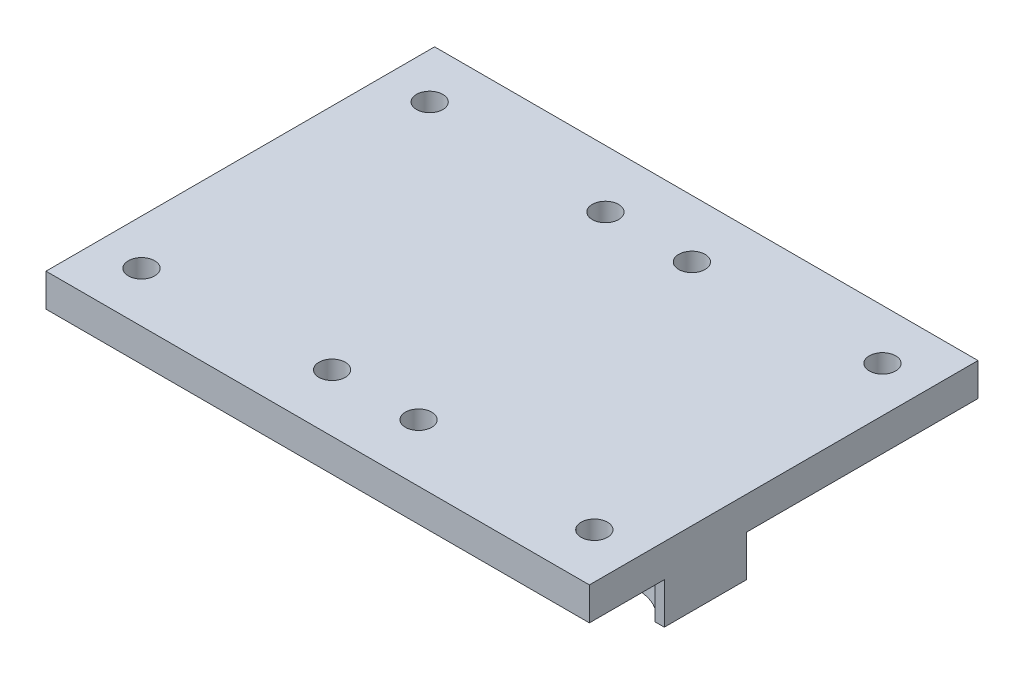
ISO-10303-21;
HEADER;
FILE_DESCRIPTION(('STEP AP214'),'2;1');
FILE_NAME('part.step','',(''),(''),'','','');
FILE_SCHEMA(('AUTOMOTIVE_DESIGN { 1 0 10303 214 1 1 1 1 }'));
ENDSEC;
DATA;
#1=APPLICATION_CONTEXT('core data for automotive mechanical design processes');
#2=APPLICATION_PROTOCOL_DEFINITION('international standard','automotive_design',2000,#1);
#3=PRODUCT_CONTEXT('',#1,'mechanical');
#4=PRODUCT('Part','Part','',(#3));
#5=PRODUCT_RELATED_PRODUCT_CATEGORY('part','',(#4));
#6=PRODUCT_DEFINITION_FORMATION('','',#4);
#7=PRODUCT_DEFINITION_CONTEXT('part definition',#1,'design');
#8=PRODUCT_DEFINITION('design','',#6,#7);
#9=PRODUCT_DEFINITION_SHAPE('','',#8);
#10=(LENGTH_UNIT() NAMED_UNIT(*) SI_UNIT(.MILLI.,.METRE.));
#11=(NAMED_UNIT(*) PLANE_ANGLE_UNIT() SI_UNIT($,.RADIAN.));
#12=(NAMED_UNIT(*) SI_UNIT($,.STERADIAN.) SOLID_ANGLE_UNIT());
#13=UNCERTAINTY_MEASURE_WITH_UNIT(LENGTH_MEASURE(1.E-05),#10,'distance_accuracy_value','');
#14=(GEOMETRIC_REPRESENTATION_CONTEXT(3) GLOBAL_UNCERTAINTY_ASSIGNED_CONTEXT((#13)) GLOBAL_UNIT_ASSIGNED_CONTEXT((#10,
#11,#12)) REPRESENTATION_CONTEXT('',''));
#15=CARTESIAN_POINT('',(0.,0.,0.));
#16=DIRECTION('',(0.,0.,1.));
#17=DIRECTION('',(1.,0.,0.));
#18=AXIS2_PLACEMENT_3D('',#15,#16,#17);
#19=CARTESIAN_POINT('',(0.,-5.,-14.5));
#20=DIRECTION('',(0.,0.,1.));
#21=DIRECTION('',(1.,0.,0.));
#22=AXIS2_PLACEMENT_3D('',#19,#20,#21);
#23=PLANE('',#22);
#24=DIRECTION('',(0.,1.,0.));
#25=VECTOR('',#24,1.);
#26=CARTESIAN_POINT('',(-23.1307895450093,-14.036038955206,-14.5));
#27=LINE('',#26,#25);
#28=CARTESIAN_POINT('',(-23.1307895450093,-5.,-14.5));
#29=VERTEX_POINT('',#28);
#30=CARTESIAN_POINT('',(-23.1307895450093,0.,-14.5));
#31=VERTEX_POINT('',#30);
#32=EDGE_CURVE('E58',#29,#31,#27,.T.);
#33=ORIENTED_EDGE('',*,*,#32,.T.);
#34=DIRECTION('',(1.,0.,0.));
#35=VECTOR('',#34,1.);
#36=CARTESIAN_POINT('',(0.,0.,-14.5));
#37=LINE('',#36,#35);
#38=CARTESIAN_POINT('',(-18.,0.,-14.5));
#39=VERTEX_POINT('',#38);
#40=EDGE_CURVE('E167',#31,#39,#37,.T.);
#41=ORIENTED_EDGE('',*,*,#40,.T.);
#42=DIRECTION('',(0.,1.,0.));
#43=VECTOR('',#42,1.);
#44=CARTESIAN_POINT('',(-18.,-5.,-14.5));
#45=LINE('',#44,#43);
#46=CARTESIAN_POINT('',(-18.,-5.,-14.5));
#47=VERTEX_POINT('',#46);
#48=EDGE_CURVE('E193',#47,#39,#45,.T.);
#49=ORIENTED_EDGE('',*,*,#48,.F.);
#50=DIRECTION('',(1.,0.,0.));
#51=VECTOR('',#50,1.);
#52=CARTESIAN_POINT('',(0.,-5.,-14.5));
#53=LINE('',#52,#51);
#54=EDGE_CURVE('E169',#29,#47,#53,.T.);
#55=ORIENTED_EDGE('',*,*,#54,.F.);
#56=EDGE_LOOP('',(#33,#41,#49,#55));
#57=FACE_BOUND('',#56,.T.);
#58=ADVANCED_FACE('F43',(#57),#23,.F.);
#59=DIRECTION('',(0.,1.,0.));
#60=VECTOR('',#59,1.);
#61=CARTESIAN_POINT('',(-31.8692104549907,-14.036038955206,-14.5));
#62=LINE('',#61,#60);
#63=CARTESIAN_POINT('',(-31.8692104549907,-5.,-14.5));
#64=VERTEX_POINT('',#63);
#65=CARTESIAN_POINT('',(-31.8692104549907,0.,-14.5));
#66=VERTEX_POINT('',#65);
#67=EDGE_CURVE('E157',#64,#66,#62,.T.);
#68=ORIENTED_EDGE('',*,*,#67,.F.);
#69=CARTESIAN_POINT('',(-33.,-5.,-14.5));
#70=VERTEX_POINT('',#69);
#71=EDGE_CURVE('E325',#70,#64,#53,.T.);
#72=ORIENTED_EDGE('',*,*,#71,.F.);
#73=DIRECTION('',(0.,1.,0.));
#74=VECTOR('',#73,1.);
#75=CARTESIAN_POINT('',(-33.,-5.,-14.5));
#76=LINE('',#75,#74);
#77=CARTESIAN_POINT('',(-33.,0.,-14.5));
#78=VERTEX_POINT('',#77);
#79=EDGE_CURVE('E191',#70,#78,#76,.T.);
#80=ORIENTED_EDGE('',*,*,#79,.T.);
#81=EDGE_CURVE('E176',#78,#66,#37,.T.);
#82=ORIENTED_EDGE('',*,*,#81,.T.);
#83=EDGE_LOOP('',(#68,#72,#80,#82));
#84=FACE_BOUND('',#83,.T.);
#85=ADVANCED_FACE('F356',(#84),#23,.F.);
#86=CARTESIAN_POINT('',(0.,-5.,0.));
#87=DIRECTION('',(0.,1.,0.));
#88=DIRECTION('',(0.,0.,1.));
#89=AXIS2_PLACEMENT_3D('',#86,#87,#88);
#90=PLANE('',#89);
#91=CARTESIAN_POINT('',(-27.5,-5.,-17.5));
#92=DIRECTION('',(0.,1.,0.));
#93=DIRECTION('',(0.,0.,1.));
#94=AXIS2_PLACEMENT_3D('',#91,#92,#93);
#95=CIRCLE('',#94,5.3);
#96=EDGE_CURVE('E170',#64,#29,#95,.T.);
#97=ORIENTED_EDGE('',*,*,#96,.T.);
#98=ORIENTED_EDGE('',*,*,#54,.T.);
#99=DIRECTION('',(0.,0.,1.));
#100=VECTOR('',#99,1.);
#101=CARTESIAN_POINT('',(-18.,-5.,0.));
#102=LINE('',#101,#100);
#103=CARTESIAN_POINT('',(-18.,-5.,-4.49999999999999));
#104=VERTEX_POINT('',#103);
#105=EDGE_CURVE('E184',#47,#104,#102,.T.);
#106=ORIENTED_EDGE('',*,*,#105,.T.);
#107=DIRECTION('',(1.,0.,0.));
#108=VECTOR('',#107,1.);
#109=CARTESIAN_POINT('',(0.,-5.,-4.49999999999999));
#110=LINE('',#109,#108);
#111=CARTESIAN_POINT('',(-33.,-5.,-4.49999999999999));
#112=VERTEX_POINT('',#111);
#113=EDGE_CURVE('E195',#112,#104,#110,.T.);
#114=ORIENTED_EDGE('',*,*,#113,.F.);
#115=DIRECTION('',(0.,0.,1.));
#116=VECTOR('',#115,1.);
#117=CARTESIAN_POINT('',(-33.,-5.,0.));
#118=LINE('',#117,#116);
#119=EDGE_CURVE('E328',#70,#112,#118,.T.);
#120=ORIENTED_EDGE('',*,*,#119,.F.);
#121=ORIENTED_EDGE('',*,*,#71,.T.);
#122=EDGE_LOOP('',(#97,#98,#106,#114,#120,#121));
#123=FACE_BOUND('',#122,.T.);
#124=ADVANCED_FACE('F337',(#123),#90,.F.);
#125=CARTESIAN_POINT('',(0.,-5.,14.5));
#126=DIRECTION('',(0.,0.,-1.));
#127=DIRECTION('',(-1.,0.,0.));
#128=AXIS2_PLACEMENT_3D('',#125,#126,#127);
#129=PLANE('',#128);
#130=DIRECTION('',(0.,1.,0.));
#131=VECTOR('',#130,1.);
#132=CARTESIAN_POINT('',(23.1307895450093,-14.036038955206,14.5));
#133=LINE('',#132,#131);
#134=CARTESIAN_POINT('',(23.1307895450093,-5.,14.5));
#135=VERTEX_POINT('',#134);
#136=CARTESIAN_POINT('',(23.1307895450093,0.,14.5));
#137=VERTEX_POINT('',#136);
#138=EDGE_CURVE('E66',#135,#137,#133,.T.);
#139=ORIENTED_EDGE('',*,*,#138,.T.);
#140=DIRECTION('',(-1.,0.,0.));
#141=VECTOR('',#140,1.);
#142=CARTESIAN_POINT('',(0.,0.,14.5));
#143=LINE('',#142,#141);
#144=CARTESIAN_POINT('',(18.,0.,14.5));
#145=VERTEX_POINT('',#144);
#146=EDGE_CURVE('E307',#137,#145,#143,.T.);
#147=ORIENTED_EDGE('',*,*,#146,.T.);
#148=DIRECTION('',(0.,1.,0.));
#149=VECTOR('',#148,1.);
#150=CARTESIAN_POINT('',(18.,-5.,14.5));
#151=LINE('',#150,#149);
#152=CARTESIAN_POINT('',(18.,-5.,14.5));
#153=VERTEX_POINT('',#152);
#154=EDGE_CURVE('E314',#153,#145,#151,.T.);
#155=ORIENTED_EDGE('',*,*,#154,.F.);
#156=DIRECTION('',(-1.,0.,0.));
#157=VECTOR('',#156,1.);
#158=CARTESIAN_POINT('',(0.,-5.,14.5));
#159=LINE('',#158,#157);
#160=EDGE_CURVE('E708',#135,#153,#159,.T.);
#161=ORIENTED_EDGE('',*,*,#160,.F.);
#162=EDGE_LOOP('',(#139,#147,#155,#161));
#163=FACE_BOUND('',#162,.T.);
#164=ADVANCED_FACE('F364',(#163),#129,.F.);
#165=DIRECTION('',(0.,1.,0.));
#166=VECTOR('',#165,1.);
#167=CARTESIAN_POINT('',(31.8692104549907,-14.036038955206,14.5));
#168=LINE('',#167,#166);
#169=CARTESIAN_POINT('',(31.8692104549907,-5.,14.5));
#170=VERTEX_POINT('',#169);
#171=CARTESIAN_POINT('',(31.8692104549907,0.,14.5));
#172=VERTEX_POINT('',#171);
#173=EDGE_CURVE('E695',#170,#172,#168,.T.);
#174=ORIENTED_EDGE('',*,*,#173,.F.);
#175=CARTESIAN_POINT('',(33.,-5.,14.5));
#176=VERTEX_POINT('',#175);
#177=EDGE_CURVE('E313',#176,#170,#159,.T.);
#178=ORIENTED_EDGE('',*,*,#177,.F.);
#179=DIRECTION('',(0.,1.,0.));
#180=VECTOR('',#179,1.);
#181=CARTESIAN_POINT('',(33.,-5.,14.5));
#182=LINE('',#181,#180);
#183=CARTESIAN_POINT('',(33.,0.,14.5));
#184=VERTEX_POINT('',#183);
#185=EDGE_CURVE('E310',#176,#184,#182,.T.);
#186=ORIENTED_EDGE('',*,*,#185,.T.);
#187=EDGE_CURVE('E301',#184,#172,#143,.T.);
#188=ORIENTED_EDGE('',*,*,#187,.T.);
#189=EDGE_LOOP('',(#174,#178,#186,#188));
#190=FACE_BOUND('',#189,.T.);
#191=ADVANCED_FACE('F311',(#190),#129,.F.);
#192=CARTESIAN_POINT('',(0.,0.,0.));
#193=DIRECTION('',(0.,1.,0.));
#194=DIRECTION('',(0.,0.,1.));
#195=AXIS2_PLACEMENT_3D('',#192,#193,#194);
#196=PLANE('',#195);
#197=CARTESIAN_POINT('',(-27.5,0.,17.5));
#198=DIRECTION('',(0.,1.,0.));
#199=DIRECTION('',(0.,0.,1.));
#200=AXIS2_PLACEMENT_3D('',#197,#198,#199);
#201=CIRCLE('',#200,1.6);
#202=CARTESIAN_POINT('',(-27.5,0.,19.1));
#203=VERTEX_POINT('',#202);
#204=EDGE_CURVE('E224',#203,#203,#201,.F.);
#205=ORIENTED_EDGE('',*,*,#204,.F.);
#206=EDGE_LOOP('',(#205));
#207=FACE_BOUND('',#206,.T.);
#208=CARTESIAN_POINT('',(27.5,0.,17.5));
#209=DIRECTION('',(0.,1.,0.));
#210=DIRECTION('',(0.,0.,1.));
#211=AXIS2_PLACEMENT_3D('',#208,#209,#210);
#212=CIRCLE('',#211,1.6);
#213=CARTESIAN_POINT('',(27.5,0.,19.1));
#214=VERTEX_POINT('',#213);
#215=EDGE_CURVE('E262',#214,#214,#212,.T.);
#216=ORIENTED_EDGE('',*,*,#215,.T.);
#217=EDGE_LOOP('',(#216));
#218=FACE_BOUND('',#217,.T.);
#219=CARTESIAN_POINT('',(-27.5,0.,-17.5));
#220=DIRECTION('',(0.,1.,0.));
#221=DIRECTION('',(0.,0.,1.));
#222=AXIS2_PLACEMENT_3D('',#219,#220,#221);
#223=CIRCLE('',#222,1.6);
#224=CARTESIAN_POINT('',(-27.5,0.,-15.9));
#225=VERTEX_POINT('',#224);
#226=EDGE_CURVE('E246',#225,#225,#223,.T.);
#227=ORIENTED_EDGE('',*,*,#226,.T.);
#228=EDGE_LOOP('',(#227));
#229=FACE_BOUND('',#228,.T.);
#230=CARTESIAN_POINT('',(27.5,0.,-17.5));
#231=DIRECTION('',(0.,1.,0.));
#232=DIRECTION('',(0.,0.,1.));
#233=AXIS2_PLACEMENT_3D('',#230,#231,#232);
#234=CIRCLE('',#233,1.6);
#235=CARTESIAN_POINT('',(27.5,0.,-15.9));
#236=VERTEX_POINT('',#235);
#237=EDGE_CURVE('E219',#236,#236,#234,.F.);
#238=ORIENTED_EDGE('',*,*,#237,.F.);
#239=EDGE_LOOP('',(#238));
#240=FACE_BOUND('',#239,.T.);
#241=CARTESIAN_POINT('',(-5.24999999999997,0.,-16.6));
#242=DIRECTION('',(0.,-1.,0.));
#243=DIRECTION('',(0.,0.,-1.));
#244=AXIS2_PLACEMENT_3D('',#241,#242,#243);
#245=CIRCLE('',#244,1.6);
#246=CARTESIAN_POINT('',(-5.24999999999997,0.,-18.2));
#247=VERTEX_POINT('',#246);
#248=EDGE_CURVE('E209',#247,#247,#245,.T.);
#249=ORIENTED_EDGE('',*,*,#248,.F.);
#250=EDGE_LOOP('',(#249));
#251=FACE_BOUND('',#250,.T.);
#252=CARTESIAN_POINT('',(5.25000000000003,0.,16.6));
#253=DIRECTION('',(0.,-1.,0.));
#254=DIRECTION('',(0.,0.,1.));
#255=AXIS2_PLACEMENT_3D('',#252,#253,#254);
#256=CIRCLE('',#255,1.6);
#257=CARTESIAN_POINT('',(5.25000000000003,0.,18.2));
#258=VERTEX_POINT('',#257);
#259=EDGE_CURVE('E198',#258,#258,#256,.T.);
#260=ORIENTED_EDGE('',*,*,#259,.F.);
#261=EDGE_LOOP('',(#260));
#262=FACE_BOUND('',#261,.T.);
#263=CARTESIAN_POINT('',(-5.24999999999997,0.,16.6));
#264=DIRECTION('',(0.,-1.,0.));
#265=DIRECTION('',(0.,0.,1.));
#266=AXIS2_PLACEMENT_3D('',#263,#264,#265);
#267=CIRCLE('',#266,1.6);
#268=CARTESIAN_POINT('',(-5.24999999999997,0.,18.2));
#269=VERTEX_POINT('',#268);
#270=EDGE_CURVE('E206',#269,#269,#267,.T.);
#271=ORIENTED_EDGE('',*,*,#270,.F.);
#272=EDGE_LOOP('',(#271));
#273=FACE_BOUND('',#272,.T.);
#274=CARTESIAN_POINT('',(5.25000000000003,0.,-16.6));
#275=DIRECTION('',(0.,-1.,0.));
#276=DIRECTION('',(0.,0.,-1.));
#277=AXIS2_PLACEMENT_3D('',#274,#275,#276);
#278=CIRCLE('',#277,1.6);
#279=CARTESIAN_POINT('',(5.25000000000003,0.,-18.2));
#280=VERTEX_POINT('',#279);
#281=EDGE_CURVE('E205',#280,#280,#278,.T.);
#282=ORIENTED_EDGE('',*,*,#281,.F.);
#283=EDGE_LOOP('',(#282));
#284=FACE_BOUND('',#283,.T.);
#285=DIRECTION('',(0.,0.,1.));
#286=VECTOR('',#285,1.);
#287=CARTESIAN_POINT('',(33.,0.,0.));
#288=LINE('',#287,#286);
#289=CARTESIAN_POINT('',(33.,0.,-23.6));
#290=VERTEX_POINT('',#289);
#291=CARTESIAN_POINT('',(33.,0.,4.5));
#292=VERTEX_POINT('',#291);
#293=EDGE_CURVE('E253',#290,#292,#288,.T.);
#294=ORIENTED_EDGE('',*,*,#293,.T.);
#295=DIRECTION('',(-1.,0.,0.));
#296=VECTOR('',#295,1.);
#297=CARTESIAN_POINT('',(0.,0.,4.5));
#298=LINE('',#297,#296);
#299=CARTESIAN_POINT('',(18.,0.,4.5));
#300=VERTEX_POINT('',#299);
#301=EDGE_CURVE('E711',#292,#300,#298,.T.);
#302=ORIENTED_EDGE('',*,*,#301,.T.);
#303=DIRECTION('',(0.,0.,1.));
#304=VECTOR('',#303,1.);
#305=CARTESIAN_POINT('',(18.,0.,0.));
#306=LINE('',#305,#304);
#307=EDGE_CURVE('E713',#300,#145,#306,.T.);
#308=ORIENTED_EDGE('',*,*,#307,.T.);
#309=ORIENTED_EDGE('',*,*,#146,.F.);
#310=CARTESIAN_POINT('',(27.5,0.,17.5));
#311=DIRECTION('',(0.,-1.,0.));
#312=DIRECTION('',(0.,0.,-1.));
#313=AXIS2_PLACEMENT_3D('',#310,#311,#312);
#314=CIRCLE('',#313,5.3);
#315=EDGE_CURVE('E162',#137,#172,#314,.T.);
#316=ORIENTED_EDGE('',*,*,#315,.T.);
#317=ORIENTED_EDGE('',*,*,#187,.F.);
#318=CARTESIAN_POINT('',(33.,0.,23.6));
#319=VERTEX_POINT('',#318);
#320=EDGE_CURVE('E252',#184,#319,#288,.T.);
#321=ORIENTED_EDGE('',*,*,#320,.T.);
#322=DIRECTION('',(1.,0.,0.));
#323=VECTOR('',#322,1.);
#324=CARTESIAN_POINT('',(0.,0.,23.6));
#325=LINE('',#324,#323);
#326=CARTESIAN_POINT('',(-33.,0.,23.6));
#327=VERTEX_POINT('',#326);
#328=EDGE_CURVE('E249',#327,#319,#325,.T.);
#329=ORIENTED_EDGE('',*,*,#328,.F.);
#330=DIRECTION('',(0.,0.,1.));
#331=VECTOR('',#330,1.);
#332=CARTESIAN_POINT('',(-33.,0.,0.));
#333=LINE('',#332,#331);
#334=CARTESIAN_POINT('',(-33.,0.,-4.49999999999999));
#335=VERTEX_POINT('',#334);
#336=EDGE_CURVE('E258',#335,#327,#333,.T.);
#337=ORIENTED_EDGE('',*,*,#336,.F.);
#338=DIRECTION('',(1.,0.,0.));
#339=VECTOR('',#338,1.);
#340=CARTESIAN_POINT('',(0.,0.,-4.49999999999999));
#341=LINE('',#340,#339);
#342=CARTESIAN_POINT('',(-18.,0.,-4.49999999999999));
#343=VERTEX_POINT('',#342);
#344=EDGE_CURVE('E178',#335,#343,#341,.T.);
#345=ORIENTED_EDGE('',*,*,#344,.T.);
#346=DIRECTION('',(0.,0.,1.));
#347=VECTOR('',#346,1.);
#348=CARTESIAN_POINT('',(-18.,0.,0.));
#349=LINE('',#348,#347);
#350=EDGE_CURVE('E175',#39,#343,#349,.T.);
#351=ORIENTED_EDGE('',*,*,#350,.F.);
#352=ORIENTED_EDGE('',*,*,#40,.F.);
#353=CARTESIAN_POINT('',(-27.5,0.,-17.5));
#354=DIRECTION('',(0.,-1.,0.));
#355=DIRECTION('',(0.,0.,-1.));
#356=AXIS2_PLACEMENT_3D('',#353,#354,#355);
#357=CIRCLE('',#356,5.3);
#358=EDGE_CURVE('E154',#31,#66,#357,.T.);
#359=ORIENTED_EDGE('',*,*,#358,.T.);
#360=ORIENTED_EDGE('',*,*,#81,.F.);
#361=CARTESIAN_POINT('',(-33.,0.,-23.6));
#362=VERTEX_POINT('',#361);
#363=EDGE_CURVE('E259',#362,#78,#333,.T.);
#364=ORIENTED_EDGE('',*,*,#363,.F.);
#365=DIRECTION('',(1.,0.,0.));
#366=VECTOR('',#365,1.);
#367=CARTESIAN_POINT('',(0.,0.,-23.6));
#368=LINE('',#367,#366);
#369=EDGE_CURVE('E255',#362,#290,#368,.T.);
#370=ORIENTED_EDGE('',*,*,#369,.T.);
#371=EDGE_LOOP('',(#294,#302,#308,#309,#316,#317,#321,#329,#337,#345,#351,#352,#359,#360,#364,#370));
#372=FACE_BOUND('',#371,.T.);
#373=ADVANCED_FACE('F173',(#207,#218,#229,#240,#251,#262,#273,#284,#372),#196,.F.);
#374=CARTESIAN_POINT('',(0.,4.,23.6));
#375=DIRECTION('',(0.,0.,-1.));
#376=DIRECTION('',(-1.,0.,0.));
#377=AXIS2_PLACEMENT_3D('',#374,#375,#376);
#378=PLANE('',#377);
#379=ORIENTED_EDGE('',*,*,#328,.T.);
#380=DIRECTION('',(0.,-1.,0.));
#381=VECTOR('',#380,1.);
#382=CARTESIAN_POINT('',(33.,4.,23.6));
#383=LINE('',#382,#381);
#384=CARTESIAN_POINT('',(33.,4.,23.6));
#385=VERTEX_POINT('',#384);
#386=EDGE_CURVE('E11',#385,#319,#383,.T.);
#387=ORIENTED_EDGE('',*,*,#386,.F.);
#388=DIRECTION('',(1.,0.,0.));
#389=VECTOR('',#388,1.);
#390=CARTESIAN_POINT('',(0.,4.,23.6));
#391=LINE('',#390,#389);
#392=CARTESIAN_POINT('',(-33.,4.,23.6));
#393=VERTEX_POINT('',#392);
#394=EDGE_CURVE('E227',#393,#385,#391,.T.);
#395=ORIENTED_EDGE('',*,*,#394,.F.);
#396=DIRECTION('',(0.,-1.,0.));
#397=VECTOR('',#396,1.);
#398=CARTESIAN_POINT('',(-33.,4.,23.6));
#399=LINE('',#398,#397);
#400=EDGE_CURVE('E243',#393,#327,#399,.T.);
#401=ORIENTED_EDGE('',*,*,#400,.T.);
#402=EDGE_LOOP('',(#379,#387,#395,#401));
#403=FACE_BOUND('',#402,.T.);
#404=ADVANCED_FACE('F297',(#403),#378,.F.);
#405=CARTESIAN_POINT('',(33.,4.,0.));
#406=DIRECTION('',(1.,0.,0.));
#407=DIRECTION('',(0.,0.,-1.));
#408=AXIS2_PLACEMENT_3D('',#405,#406,#407);
#409=PLANE('',#408);
#410=ORIENTED_EDGE('',*,*,#293,.F.);
#411=DIRECTION('',(0.,-1.,0.));
#412=VECTOR('',#411,1.);
#413=CARTESIAN_POINT('',(33.,4.,-23.6));
#414=LINE('',#413,#412);
#415=CARTESIAN_POINT('',(33.,4.,-23.6));
#416=VERTEX_POINT('',#415);
#417=EDGE_CURVE('E51',#416,#290,#414,.T.);
#418=ORIENTED_EDGE('',*,*,#417,.F.);
#419=DIRECTION('',(0.,0.,1.));
#420=VECTOR('',#419,1.);
#421=CARTESIAN_POINT('',(33.,4.,0.));
#422=LINE('',#421,#420);
#423=EDGE_CURVE('E229',#416,#385,#422,.T.);
#424=ORIENTED_EDGE('',*,*,#423,.T.);
#425=ORIENTED_EDGE('',*,*,#386,.T.);
#426=ORIENTED_EDGE('',*,*,#320,.F.);
#427=ORIENTED_EDGE('',*,*,#185,.F.);
#428=DIRECTION('',(0.,0.,1.));
#429=VECTOR('',#428,1.);
#430=CARTESIAN_POINT('',(33.,-5.,0.));
#431=LINE('',#430,#429);
#432=CARTESIAN_POINT('',(33.,-5.,4.5));
#433=VERTEX_POINT('',#432);
#434=EDGE_CURVE('E323',#433,#176,#431,.T.);
#435=ORIENTED_EDGE('',*,*,#434,.F.);
#436=DIRECTION('',(0.,1.,0.));
#437=VECTOR('',#436,1.);
#438=CARTESIAN_POINT('',(33.,-5.,4.5));
#439=LINE('',#438,#437);
#440=EDGE_CURVE('E179',#433,#292,#439,.T.);
#441=ORIENTED_EDGE('',*,*,#440,.T.);
#442=EDGE_LOOP('',(#410,#418,#424,#425,#426,#427,#435,#441));
#443=FACE_BOUND('',#442,.T.);
#444=ADVANCED_FACE('F278',(#443),#409,.T.);
#445=CARTESIAN_POINT('',(0.,4.,-23.6));
#446=DIRECTION('',(0.,0.,-1.));
#447=DIRECTION('',(-1.,0.,0.));
#448=AXIS2_PLACEMENT_3D('',#445,#446,#447);
#449=PLANE('',#448);
#450=ORIENTED_EDGE('',*,*,#369,.F.);
#451=DIRECTION('',(0.,-1.,0.));
#452=VECTOR('',#451,1.);
#453=CARTESIAN_POINT('',(-33.,4.,-23.6));
#454=LINE('',#453,#452);
#455=CARTESIAN_POINT('',(-33.,4.,-23.6));
#456=VERTEX_POINT('',#455);
#457=EDGE_CURVE('E269',#456,#362,#454,.T.);
#458=ORIENTED_EDGE('',*,*,#457,.F.);
#459=DIRECTION('',(1.,0.,0.));
#460=VECTOR('',#459,1.);
#461=CARTESIAN_POINT('',(0.,4.,-23.6));
#462=LINE('',#461,#460);
#463=EDGE_CURVE('E232',#456,#416,#462,.T.);
#464=ORIENTED_EDGE('',*,*,#463,.T.);
#465=ORIENTED_EDGE('',*,*,#417,.T.);
#466=EDGE_LOOP('',(#450,#458,#464,#465));
#467=FACE_BOUND('',#466,.T.);
#468=ADVANCED_FACE('F273',(#467),#449,.T.);
#469=CARTESIAN_POINT('',(27.5,4.,17.5));
#470=DIRECTION('',(0.,-1.,0.));
#471=DIRECTION('',(0.,0.,-1.));
#472=AXIS2_PLACEMENT_3D('',#469,#470,#471);
#473=CYLINDRICAL_SURFACE('',#472,1.6);
#474=CARTESIAN_POINT('',(27.5,4.,17.5));
#475=DIRECTION('',(0.,1.,0.));
#476=DIRECTION('',(0.,0.,1.));
#477=AXIS2_PLACEMENT_3D('',#474,#475,#476);
#478=CIRCLE('',#477,1.6);
#479=CARTESIAN_POINT('',(27.5,4.,19.1));
#480=VERTEX_POINT('',#479);
#481=EDGE_CURVE('E237',#480,#480,#478,.T.);
#482=ORIENTED_EDGE('',*,*,#481,.T.);
#483=EDGE_LOOP('',(#482));
#484=FACE_BOUND('',#483,.T.);
#485=ORIENTED_EDGE('',*,*,#215,.F.);
#486=EDGE_LOOP('',(#485));
#487=FACE_BOUND('',#486,.T.);
#488=ADVANCED_FACE('F422',(#484,#487),#473,.F.);
#489=CARTESIAN_POINT('',(-33.,4.,0.));
#490=DIRECTION('',(1.,0.,0.));
#491=DIRECTION('',(0.,0.,-1.));
#492=AXIS2_PLACEMENT_3D('',#489,#490,#491);
#493=PLANE('',#492);
#494=ORIENTED_EDGE('',*,*,#363,.T.);
#495=ORIENTED_EDGE('',*,*,#79,.F.);
#496=ORIENTED_EDGE('',*,*,#119,.T.);
#497=DIRECTION('',(0.,1.,0.));
#498=VECTOR('',#497,1.);
#499=CARTESIAN_POINT('',(-33.,-5.,-4.49999999999999));
#500=LINE('',#499,#498);
#501=EDGE_CURVE('E189',#112,#335,#500,.T.);
#502=ORIENTED_EDGE('',*,*,#501,.T.);
#503=ORIENTED_EDGE('',*,*,#336,.T.);
#504=ORIENTED_EDGE('',*,*,#400,.F.);
#505=DIRECTION('',(0.,0.,1.));
#506=VECTOR('',#505,1.);
#507=CARTESIAN_POINT('',(-33.,4.,0.));
#508=LINE('',#507,#506);
#509=EDGE_CURVE('E235',#456,#393,#508,.T.);
#510=ORIENTED_EDGE('',*,*,#509,.F.);
#511=ORIENTED_EDGE('',*,*,#457,.T.);
#512=EDGE_LOOP('',(#494,#495,#496,#502,#503,#504,#510,#511));
#513=FACE_BOUND('',#512,.T.);
#514=ADVANCED_FACE('F283',(#513),#493,.F.);
#515=CARTESIAN_POINT('',(-27.5,4.,-17.5));
#516=DIRECTION('',(0.,-1.,0.));
#517=DIRECTION('',(0.,0.,-1.));
#518=AXIS2_PLACEMENT_3D('',#515,#516,#517);
#519=CYLINDRICAL_SURFACE('',#518,1.6);
#520=CARTESIAN_POINT('',(-27.5,4.,-17.5));
#521=DIRECTION('',(0.,1.,0.));
#522=DIRECTION('',(0.,0.,1.));
#523=AXIS2_PLACEMENT_3D('',#520,#521,#522);
#524=CIRCLE('',#523,1.6);
#525=CARTESIAN_POINT('',(-27.5,4.,-15.9));
#526=VERTEX_POINT('',#525);
#527=EDGE_CURVE('E223',#526,#526,#524,.T.);
#528=ORIENTED_EDGE('',*,*,#527,.T.);
#529=EDGE_LOOP('',(#528));
#530=FACE_BOUND('',#529,.T.);
#531=ORIENTED_EDGE('',*,*,#226,.F.);
#532=EDGE_LOOP('',(#531));
#533=FACE_BOUND('',#532,.T.);
#534=ADVANCED_FACE('F421',(#530,#533),#519,.F.);
#535=CARTESIAN_POINT('',(27.5,4.,-17.5));
#536=DIRECTION('',(0.,-1.,0.));
#537=DIRECTION('',(0.,0.,-1.));
#538=AXIS2_PLACEMENT_3D('',#535,#536,#537);
#539=CYLINDRICAL_SURFACE('',#538,1.6);
#540=CARTESIAN_POINT('',(27.5,4.,-17.5));
#541=DIRECTION('',(0.,1.,0.));
#542=DIRECTION('',(0.,0.,1.));
#543=AXIS2_PLACEMENT_3D('',#540,#541,#542);
#544=CIRCLE('',#543,1.6);
#545=CARTESIAN_POINT('',(27.5,4.,-15.9));
#546=VERTEX_POINT('',#545);
#547=EDGE_CURVE('E220',#546,#546,#544,.F.);
#548=ORIENTED_EDGE('',*,*,#547,.F.);
#549=EDGE_LOOP('',(#548));
#550=FACE_BOUND('',#549,.T.);
#551=ORIENTED_EDGE('',*,*,#237,.T.);
#552=EDGE_LOOP('',(#551));
#553=FACE_BOUND('',#552,.T.);
#554=ADVANCED_FACE('F45',(#550,#553),#539,.F.);
#555=CARTESIAN_POINT('',(-27.5,4.,17.5));
#556=DIRECTION('',(0.,-1.,0.));
#557=DIRECTION('',(0.,0.,-1.));
#558=AXIS2_PLACEMENT_3D('',#555,#556,#557);
#559=CYLINDRICAL_SURFACE('',#558,1.6);
#560=CARTESIAN_POINT('',(-27.5,4.,17.5));
#561=DIRECTION('',(0.,1.,0.));
#562=DIRECTION('',(0.,0.,1.));
#563=AXIS2_PLACEMENT_3D('',#560,#561,#562);
#564=CIRCLE('',#563,1.6);
#565=CARTESIAN_POINT('',(-27.5,4.,19.1));
#566=VERTEX_POINT('',#565);
#567=EDGE_CURVE('E240',#566,#566,#564,.F.);
#568=ORIENTED_EDGE('',*,*,#567,.F.);
#569=EDGE_LOOP('',(#568));
#570=FACE_BOUND('',#569,.T.);
#571=ORIENTED_EDGE('',*,*,#204,.T.);
#572=EDGE_LOOP('',(#571));
#573=FACE_BOUND('',#572,.T.);
#574=ADVANCED_FACE('F484',(#570,#573),#559,.F.);
#575=CARTESIAN_POINT('',(0.,4.,0.));
#576=DIRECTION('',(0.,1.,0.));
#577=DIRECTION('',(0.,0.,1.));
#578=AXIS2_PLACEMENT_3D('',#575,#576,#577);
#579=PLANE('',#578);
#580=CARTESIAN_POINT('',(5.25000000000003,4.,-16.6));
#581=DIRECTION('',(0.,1.,0.));
#582=DIRECTION('',(0.,0.,1.));
#583=AXIS2_PLACEMENT_3D('',#580,#581,#582);
#584=CIRCLE('',#583,1.6);
#585=CARTESIAN_POINT('',(5.25000000000003,4.,-15.));
#586=VERTEX_POINT('',#585);
#587=EDGE_CURVE('E202',#586,#586,#584,.F.);
#588=ORIENTED_EDGE('',*,*,#587,.T.);
#589=EDGE_LOOP('',(#588));
#590=FACE_BOUND('',#589,.T.);
#591=CARTESIAN_POINT('',(-5.24999999999997,4.,16.6));
#592=DIRECTION('',(0.,1.,0.));
#593=DIRECTION('',(0.,0.,1.));
#594=AXIS2_PLACEMENT_3D('',#591,#592,#593);
#595=CIRCLE('',#594,1.6);
#596=CARTESIAN_POINT('',(-5.24999999999997,4.,18.2));
#597=VERTEX_POINT('',#596);
#598=EDGE_CURVE('E201',#597,#597,#595,.F.);
#599=ORIENTED_EDGE('',*,*,#598,.T.);
#600=EDGE_LOOP('',(#599));
#601=FACE_BOUND('',#600,.T.);
#602=CARTESIAN_POINT('',(5.25000000000003,4.,16.6));
#603=DIRECTION('',(0.,1.,0.));
#604=DIRECTION('',(0.,0.,1.));
#605=AXIS2_PLACEMENT_3D('',#602,#603,#604);
#606=CIRCLE('',#605,1.6);
#607=CARTESIAN_POINT('',(5.25000000000003,4.,18.2));
#608=VERTEX_POINT('',#607);
#609=EDGE_CURVE('E188',#608,#608,#606,.F.);
#610=ORIENTED_EDGE('',*,*,#609,.T.);
#611=EDGE_LOOP('',(#610));
#612=FACE_BOUND('',#611,.T.);
#613=CARTESIAN_POINT('',(-5.24999999999997,4.,-16.6));
#614=DIRECTION('',(0.,1.,0.));
#615=DIRECTION('',(0.,0.,1.));
#616=AXIS2_PLACEMENT_3D('',#613,#614,#615);
#617=CIRCLE('',#616,1.6);
#618=CARTESIAN_POINT('',(-5.24999999999997,4.,-15.));
#619=VERTEX_POINT('',#618);
#620=EDGE_CURVE('E216',#619,#619,#617,.F.);
#621=ORIENTED_EDGE('',*,*,#620,.T.);
#622=EDGE_LOOP('',(#621));
#623=FACE_BOUND('',#622,.T.);
#624=ORIENTED_EDGE('',*,*,#547,.T.);
#625=EDGE_LOOP('',(#624));
#626=FACE_BOUND('',#625,.T.);
#627=ORIENTED_EDGE('',*,*,#527,.F.);
#628=EDGE_LOOP('',(#627));
#629=FACE_BOUND('',#628,.T.);
#630=ORIENTED_EDGE('',*,*,#394,.T.);
#631=ORIENTED_EDGE('',*,*,#423,.F.);
#632=ORIENTED_EDGE('',*,*,#463,.F.);
#633=ORIENTED_EDGE('',*,*,#509,.T.);
#634=EDGE_LOOP('',(#630,#631,#632,#633));
#635=FACE_BOUND('',#634,.T.);
#636=ORIENTED_EDGE('',*,*,#481,.F.);
#637=EDGE_LOOP('',(#636));
#638=FACE_BOUND('',#637,.T.);
#639=ORIENTED_EDGE('',*,*,#567,.T.);
#640=EDGE_LOOP('',(#639));
#641=FACE_BOUND('',#640,.T.);
#642=ADVANCED_FACE('F290',(#590,#601,#612,#623,#626,#629,#635,#638,#641),#579,.T.);
#643=CARTESIAN_POINT('',(-5.24999999999997,8.52548339959391,-16.6));
#644=DIRECTION('',(0.,-1.,0.));
#645=DIRECTION('',(0.,0.,-1.));
#646=AXIS2_PLACEMENT_3D('',#643,#644,#645);
#647=CYLINDRICAL_SURFACE('',#646,1.6);
#648=ORIENTED_EDGE('',*,*,#248,.T.);
#649=EDGE_LOOP('',(#648));
#650=FACE_BOUND('',#649,.T.);
#651=ORIENTED_EDGE('',*,*,#620,.F.);
#652=EDGE_LOOP('',(#651));
#653=FACE_BOUND('',#652,.T.);
#654=ADVANCED_FACE('F464',(#650,#653),#647,.F.);
#655=CARTESIAN_POINT('',(5.25000000000003,8.52548339959391,16.6));
#656=DIRECTION('',(0.,-1.,0.));
#657=DIRECTION('',(0.,0.,-1.));
#658=AXIS2_PLACEMENT_3D('',#655,#656,#657);
#659=CYLINDRICAL_SURFACE('',#658,1.6);
#660=ORIENTED_EDGE('',*,*,#259,.T.);
#661=EDGE_LOOP('',(#660));
#662=FACE_BOUND('',#661,.T.);
#663=ORIENTED_EDGE('',*,*,#609,.F.);
#664=EDGE_LOOP('',(#663));
#665=FACE_BOUND('',#664,.T.);
#666=ADVANCED_FACE('F453',(#662,#665),#659,.F.);
#667=CARTESIAN_POINT('',(-5.24999999999997,8.52548339959391,16.6));
#668=DIRECTION('',(0.,-1.,0.));
#669=DIRECTION('',(0.,0.,-1.));
#670=AXIS2_PLACEMENT_3D('',#667,#668,#669);
#671=CYLINDRICAL_SURFACE('',#670,1.6);
#672=ORIENTED_EDGE('',*,*,#270,.T.);
#673=EDGE_LOOP('',(#672));
#674=FACE_BOUND('',#673,.T.);
#675=ORIENTED_EDGE('',*,*,#598,.F.);
#676=EDGE_LOOP('',(#675));
#677=FACE_BOUND('',#676,.T.);
#678=ADVANCED_FACE('F350',(#674,#677),#671,.F.);
#679=CARTESIAN_POINT('',(5.25000000000003,8.52548339959391,-16.6));
#680=DIRECTION('',(0.,-1.,0.));
#681=DIRECTION('',(0.,0.,-1.));
#682=AXIS2_PLACEMENT_3D('',#679,#680,#681);
#683=CYLINDRICAL_SURFACE('',#682,1.6);
#684=ORIENTED_EDGE('',*,*,#281,.T.);
#685=EDGE_LOOP('',(#684));
#686=FACE_BOUND('',#685,.T.);
#687=ORIENTED_EDGE('',*,*,#587,.F.);
#688=EDGE_LOOP('',(#687));
#689=FACE_BOUND('',#688,.T.);
#690=ADVANCED_FACE('F342',(#686,#689),#683,.F.);
#691=CARTESIAN_POINT('',(-18.,-5.,0.));
#692=DIRECTION('',(-1.,0.,0.));
#693=DIRECTION('',(0.,0.,1.));
#694=AXIS2_PLACEMENT_3D('',#691,#692,#693);
#695=PLANE('',#694);
#696=ORIENTED_EDGE('',*,*,#350,.T.);
#697=DIRECTION('',(0.,1.,0.));
#698=VECTOR('',#697,1.);
#699=CARTESIAN_POINT('',(-18.,-5.,-4.49999999999999));
#700=LINE('',#699,#698);
#701=EDGE_CURVE('E185',#104,#343,#700,.T.);
#702=ORIENTED_EDGE('',*,*,#701,.F.);
#703=ORIENTED_EDGE('',*,*,#105,.F.);
#704=ORIENTED_EDGE('',*,*,#48,.T.);
#705=EDGE_LOOP('',(#696,#702,#703,#704));
#706=FACE_BOUND('',#705,.T.);
#707=ADVANCED_FACE('F340',(#706),#695,.F.);
#708=CARTESIAN_POINT('',(0.,-5.,-4.49999999999999));
#709=DIRECTION('',(0.,0.,1.));
#710=DIRECTION('',(1.,0.,0.));
#711=AXIS2_PLACEMENT_3D('',#708,#709,#710);
#712=PLANE('',#711);
#713=ORIENTED_EDGE('',*,*,#344,.F.);
#714=ORIENTED_EDGE('',*,*,#501,.F.);
#715=ORIENTED_EDGE('',*,*,#113,.T.);
#716=ORIENTED_EDGE('',*,*,#701,.T.);
#717=EDGE_LOOP('',(#713,#714,#715,#716));
#718=FACE_BOUND('',#717,.T.);
#719=ADVANCED_FACE('F333',(#718),#712,.T.);
#720=CARTESIAN_POINT('',(0.,-5.,4.5));
#721=DIRECTION('',(0.,0.,-1.));
#722=DIRECTION('',(-1.,0.,0.));
#723=AXIS2_PLACEMENT_3D('',#720,#721,#722);
#724=PLANE('',#723);
#725=ORIENTED_EDGE('',*,*,#301,.F.);
#726=ORIENTED_EDGE('',*,*,#440,.F.);
#727=DIRECTION('',(-1.,0.,0.));
#728=VECTOR('',#727,1.);
#729=CARTESIAN_POINT('',(0.,-5.,4.5));
#730=LINE('',#729,#728);
#731=CARTESIAN_POINT('',(18.,-5.,4.5));
#732=VERTEX_POINT('',#731);
#733=EDGE_CURVE('E306',#433,#732,#730,.T.);
#734=ORIENTED_EDGE('',*,*,#733,.T.);
#735=DIRECTION('',(0.,1.,0.));
#736=VECTOR('',#735,1.);
#737=CARTESIAN_POINT('',(18.,-5.,4.5));
#738=LINE('',#737,#736);
#739=EDGE_CURVE('E318',#732,#300,#738,.T.);
#740=ORIENTED_EDGE('',*,*,#739,.T.);
#741=EDGE_LOOP('',(#725,#726,#734,#740));
#742=FACE_BOUND('',#741,.T.);
#743=ADVANCED_FACE('F348',(#742),#724,.T.);
#744=CARTESIAN_POINT('',(18.,-5.,0.));
#745=DIRECTION('',(-1.,0.,0.));
#746=DIRECTION('',(0.,0.,1.));
#747=AXIS2_PLACEMENT_3D('',#744,#745,#746);
#748=PLANE('',#747);
#749=ORIENTED_EDGE('',*,*,#307,.F.);
#750=ORIENTED_EDGE('',*,*,#739,.F.);
#751=DIRECTION('',(0.,0.,1.));
#752=VECTOR('',#751,1.);
#753=CARTESIAN_POINT('',(18.,-5.,0.));
#754=LINE('',#753,#752);
#755=EDGE_CURVE('E705',#732,#153,#754,.T.);
#756=ORIENTED_EDGE('',*,*,#755,.T.);
#757=ORIENTED_EDGE('',*,*,#154,.T.);
#758=EDGE_LOOP('',(#749,#750,#756,#757));
#759=FACE_BOUND('',#758,.T.);
#760=ADVANCED_FACE('F367',(#759),#748,.T.);
#761=CARTESIAN_POINT('',(0.,-5.,0.));
#762=DIRECTION('',(0.,1.,0.));
#763=DIRECTION('',(0.,0.,1.));
#764=AXIS2_PLACEMENT_3D('',#761,#762,#763);
#765=PLANE('',#764);
#766=CARTESIAN_POINT('',(27.5,-5.,17.5));
#767=DIRECTION('',(0.,1.,0.));
#768=DIRECTION('',(0.,0.,1.));
#769=AXIS2_PLACEMENT_3D('',#766,#767,#768);
#770=CIRCLE('',#769,5.3);
#771=EDGE_CURVE('E696',#170,#135,#770,.T.);
#772=ORIENTED_EDGE('',*,*,#771,.T.);
#773=ORIENTED_EDGE('',*,*,#160,.T.);
#774=ORIENTED_EDGE('',*,*,#755,.F.);
#775=ORIENTED_EDGE('',*,*,#733,.F.);
#776=ORIENTED_EDGE('',*,*,#434,.T.);
#777=ORIENTED_EDGE('',*,*,#177,.T.);
#778=EDGE_LOOP('',(#772,#773,#774,#775,#776,#777));
#779=FACE_BOUND('',#778,.T.);
#780=ADVANCED_FACE('F371',(#779),#765,.F.);
#781=CARTESIAN_POINT('',(27.5,-14.036038955206,17.5));
#782=DIRECTION('',(0.,1.,0.));
#783=DIRECTION('',(0.,0.,1.));
#784=AXIS2_PLACEMENT_3D('',#781,#782,#783);
#785=CYLINDRICAL_SURFACE('',#784,5.3);
#786=ORIENTED_EDGE('',*,*,#173,.T.);
#787=ORIENTED_EDGE('',*,*,#315,.F.);
#788=ORIENTED_EDGE('',*,*,#138,.F.);
#789=ORIENTED_EDGE('',*,*,#771,.F.);
#790=EDGE_LOOP('',(#786,#787,#788,#789));
#791=FACE_BOUND('',#790,.T.);
#792=ADVANCED_FACE('F378',(#791),#785,.F.);
#793=CARTESIAN_POINT('',(-27.5,-14.036038955206,-17.5));
#794=DIRECTION('',(0.,1.,0.));
#795=DIRECTION('',(0.,0.,1.));
#796=AXIS2_PLACEMENT_3D('',#793,#794,#795);
#797=CYLINDRICAL_SURFACE('',#796,5.3);
#798=ORIENTED_EDGE('',*,*,#67,.T.);
#799=ORIENTED_EDGE('',*,*,#358,.F.);
#800=ORIENTED_EDGE('',*,*,#32,.F.);
#801=ORIENTED_EDGE('',*,*,#96,.F.);
#802=EDGE_LOOP('',(#798,#799,#800,#801));
#803=FACE_BOUND('',#802,.T.);
#804=ADVANCED_FACE('F155',(#803),#797,.F.);
#805=CLOSED_SHELL('',(#58,#85,#124,#164,#191,#373,#404,#444,#468,#488,#514,#534,#554,#574,#642,
#654,#666,#678,#690,#707,#719,#743,#760,#780,#792,#804));
#806=MANIFOLD_SOLID_BREP('B2',#805);
#807=ADVANCED_BREP_SHAPE_REPRESENTATION('',(#18,#806),#14);
#808=SHAPE_DEFINITION_REPRESENTATION(#9,#807);
ENDSEC;
END-ISO-10303-21;
